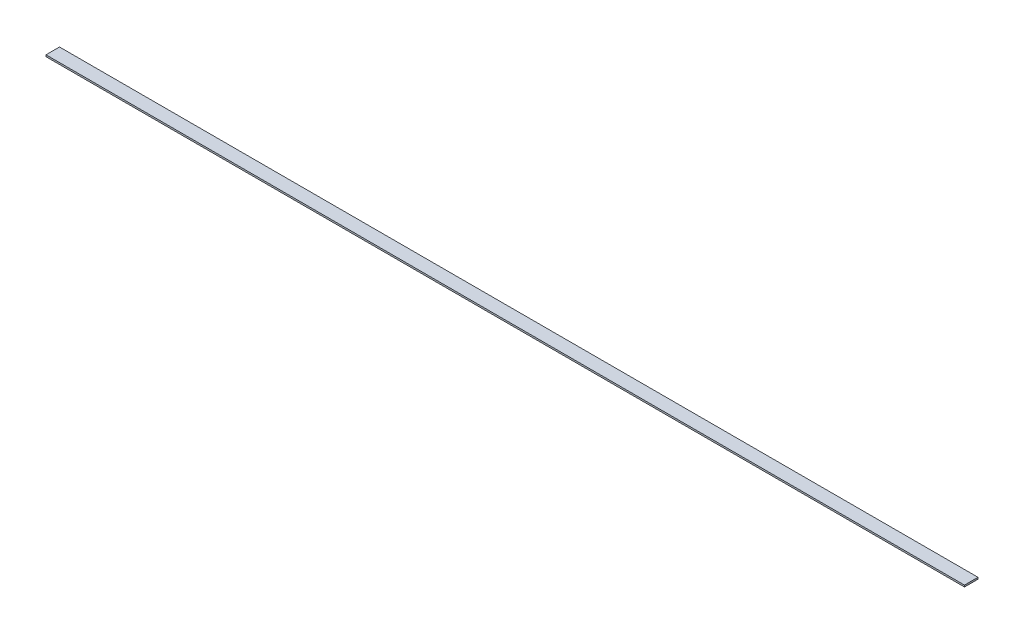
ISO-10303-21;
HEADER;
FILE_DESCRIPTION(('STEP AP214'),'2;1');
FILE_NAME('part.step','',(''),(''),'','','');
FILE_SCHEMA(('AUTOMOTIVE_DESIGN { 1 0 10303 214 1 1 1 1 }'));
ENDSEC;
DATA;
#1=APPLICATION_CONTEXT('core data for automotive mechanical design processes');
#2=APPLICATION_PROTOCOL_DEFINITION('international standard','automotive_design',2000,#1);
#3=PRODUCT_CONTEXT('',#1,'mechanical');
#4=PRODUCT('Part','Part','',(#3));
#5=PRODUCT_RELATED_PRODUCT_CATEGORY('part','',(#4));
#6=PRODUCT_DEFINITION_FORMATION('','',#4);
#7=PRODUCT_DEFINITION_CONTEXT('part definition',#1,'design');
#8=PRODUCT_DEFINITION('design','',#6,#7);
#9=PRODUCT_DEFINITION_SHAPE('','',#8);
#10=(LENGTH_UNIT() NAMED_UNIT(*) SI_UNIT(.MILLI.,.METRE.));
#11=(NAMED_UNIT(*) PLANE_ANGLE_UNIT() SI_UNIT($,.RADIAN.));
#12=(NAMED_UNIT(*) SI_UNIT($,.STERADIAN.) SOLID_ANGLE_UNIT());
#13=UNCERTAINTY_MEASURE_WITH_UNIT(LENGTH_MEASURE(1.E-05),#10,'distance_accuracy_value','');
#14=(GEOMETRIC_REPRESENTATION_CONTEXT(3) GLOBAL_UNCERTAINTY_ASSIGNED_CONTEXT((#13)) GLOBAL_UNIT_ASSIGNED_CONTEXT((#10,
#11,#12)) REPRESENTATION_CONTEXT('',''));
#15=CARTESIAN_POINT('',(0.,0.,0.));
#16=DIRECTION('',(0.,0.,1.));
#17=DIRECTION('',(1.,0.,0.));
#18=AXIS2_PLACEMENT_3D('',#15,#16,#17);
#19=CARTESIAN_POINT('',(863.6,3.17499999999987,12.6999999999997));
#20=DIRECTION('',(-1.,0.,0.));
#21=DIRECTION('',(0.,0.,1.));
#22=AXIS2_PLACEMENT_3D('',#19,#20,#21);
#23=PLANE('',#22);
#24=DIRECTION('',(0.,0.,-1.));
#25=VECTOR('',#24,1.);
#26=CARTESIAN_POINT('',(863.6,0.,12.7));
#27=LINE('',#26,#25);
#28=CARTESIAN_POINT('',(863.6,0.,12.7));
#29=VERTEX_POINT('',#28);
#30=CARTESIAN_POINT('',(863.6,0.,-12.7000000000001));
#31=VERTEX_POINT('',#30);
#32=EDGE_CURVE('E122',#29,#31,#27,.T.);
#33=ORIENTED_EDGE('',*,*,#32,.T.);
#34=DIRECTION('',(0.,-1.,0.));
#35=VECTOR('',#34,1.);
#36=CARTESIAN_POINT('',(863.6,3.17500000000013,-12.7000000000003));
#37=LINE('',#36,#35);
#38=CARTESIAN_POINT('',(863.6,3.17500000000013,-12.7000000000003));
#39=VERTEX_POINT('',#38);
#40=EDGE_CURVE('E11',#39,#31,#37,.T.);
#41=ORIENTED_EDGE('',*,*,#40,.F.);
#42=DIRECTION('',(0.,0.,-1.));
#43=VECTOR('',#42,1.);
#44=CARTESIAN_POINT('',(863.6,3.17499999999987,12.6999999999997));
#45=LINE('',#44,#43);
#46=CARTESIAN_POINT('',(863.6,3.17499999999987,12.6999999999997));
#47=VERTEX_POINT('',#46);
#48=EDGE_CURVE('E104',#47,#39,#45,.T.);
#49=ORIENTED_EDGE('',*,*,#48,.F.);
#50=DIRECTION('',(0.,-1.,0.));
#51=VECTOR('',#50,1.);
#52=CARTESIAN_POINT('',(863.6,3.17499999999987,12.6999999999997));
#53=LINE('',#52,#51);
#54=EDGE_CURVE('E118',#47,#29,#53,.T.);
#55=ORIENTED_EDGE('',*,*,#54,.T.);
#56=EDGE_LOOP('',(#33,#41,#49,#55));
#57=FACE_BOUND('',#56,.T.);
#58=ADVANCED_FACE('F44',(#57),#23,.F.);
#59=CARTESIAN_POINT('',(-863.6,3.17500000000013,-12.7000000000003));
#60=DIRECTION('',(0.,0.,1.));
#61=DIRECTION('',(1.,0.,0.));
#62=AXIS2_PLACEMENT_3D('',#59,#60,#61);
#63=PLANE('',#62);
#64=DIRECTION('',(-1.,0.,0.));
#65=VECTOR('',#64,1.);
#66=CARTESIAN_POINT('',(-863.6,0.,-12.7000000000001));
#67=LINE('',#66,#65);
#68=CARTESIAN_POINT('',(-863.6,0.,-12.7000000000001));
#69=VERTEX_POINT('',#68);
#70=EDGE_CURVE('E109',#31,#69,#67,.T.);
#71=ORIENTED_EDGE('',*,*,#70,.T.);
#72=DIRECTION('',(0.,-1.,0.));
#73=VECTOR('',#72,1.);
#74=CARTESIAN_POINT('',(-863.6,3.17500000000013,-12.7000000000003));
#75=LINE('',#74,#73);
#76=CARTESIAN_POINT('',(-863.6,3.17500000000013,-12.7000000000003));
#77=VERTEX_POINT('',#76);
#78=EDGE_CURVE('E53',#77,#69,#75,.T.);
#79=ORIENTED_EDGE('',*,*,#78,.F.);
#80=DIRECTION('',(-1.,0.,0.));
#81=VECTOR('',#80,1.);
#82=CARTESIAN_POINT('',(-863.6,3.17500000000013,-12.7000000000003));
#83=LINE('',#82,#81);
#84=EDGE_CURVE('E99',#39,#77,#83,.T.);
#85=ORIENTED_EDGE('',*,*,#84,.F.);
#86=ORIENTED_EDGE('',*,*,#40,.T.);
#87=EDGE_LOOP('',(#71,#79,#85,#86));
#88=FACE_BOUND('',#87,.T.);
#89=ADVANCED_FACE('F108',(#88),#63,.F.);
#90=CARTESIAN_POINT('',(-863.6,3.17499999999987,12.6999999999997));
#91=DIRECTION('',(1.,0.,0.));
#92=DIRECTION('',(0.,0.,-1.));
#93=AXIS2_PLACEMENT_3D('',#90,#91,#92);
#94=PLANE('',#93);
#95=DIRECTION('',(0.,0.,1.));
#96=VECTOR('',#95,1.);
#97=CARTESIAN_POINT('',(-863.6,0.,12.7));
#98=LINE('',#97,#96);
#99=CARTESIAN_POINT('',(-863.6,0.,12.7));
#100=VERTEX_POINT('',#99);
#101=EDGE_CURVE('E85',#69,#100,#98,.T.);
#102=ORIENTED_EDGE('',*,*,#101,.T.);
#103=DIRECTION('',(0.,-1.,0.));
#104=VECTOR('',#103,1.);
#105=CARTESIAN_POINT('',(-863.6,3.17499999999987,12.6999999999997));
#106=LINE('',#105,#104);
#107=CARTESIAN_POINT('',(-863.6,3.17499999999987,12.6999999999997));
#108=VERTEX_POINT('',#107);
#109=EDGE_CURVE('E111',#108,#100,#106,.T.);
#110=ORIENTED_EDGE('',*,*,#109,.F.);
#111=DIRECTION('',(0.,0.,1.));
#112=VECTOR('',#111,1.);
#113=CARTESIAN_POINT('',(-863.6,3.17499999999987,12.6999999999997));
#114=LINE('',#113,#112);
#115=EDGE_CURVE('E102',#77,#108,#114,.T.);
#116=ORIENTED_EDGE('',*,*,#115,.F.);
#117=ORIENTED_EDGE('',*,*,#78,.T.);
#118=EDGE_LOOP('',(#102,#110,#116,#117));
#119=FACE_BOUND('',#118,.T.);
#120=ADVANCED_FACE('F112',(#119),#94,.F.);
#121=CARTESIAN_POINT('',(-863.6,3.17499999999987,12.6999999999997));
#122=DIRECTION('',(0.,0.,-1.));
#123=DIRECTION('',(-1.,0.,0.));
#124=AXIS2_PLACEMENT_3D('',#121,#122,#123);
#125=PLANE('',#124);
#126=DIRECTION('',(1.,0.,0.));
#127=VECTOR('',#126,1.);
#128=CARTESIAN_POINT('',(-863.6,0.,12.7));
#129=LINE('',#128,#127);
#130=EDGE_CURVE('E92',#100,#29,#129,.T.);
#131=ORIENTED_EDGE('',*,*,#130,.T.);
#132=ORIENTED_EDGE('',*,*,#54,.F.);
#133=DIRECTION('',(1.,0.,0.));
#134=VECTOR('',#133,1.);
#135=CARTESIAN_POINT('',(-863.6,3.17499999999987,12.6999999999997));
#136=LINE('',#135,#134);
#137=EDGE_CURVE('E63',#108,#47,#136,.T.);
#138=ORIENTED_EDGE('',*,*,#137,.F.);
#139=ORIENTED_EDGE('',*,*,#109,.T.);
#140=EDGE_LOOP('',(#131,#132,#138,#139));
#141=FACE_BOUND('',#140,.T.);
#142=ADVANCED_FACE('F137',(#141),#125,.F.);
#143=CARTESIAN_POINT('',(0.,3.175,-5.27355936696949E-13));
#144=DIRECTION('',(0.,-1.,0.));
#145=DIRECTION('',(0.,0.,-1.));
#146=AXIS2_PLACEMENT_3D('',#143,#144,#145);
#147=PLANE('',#146);
#148=ORIENTED_EDGE('',*,*,#48,.T.);
#149=ORIENTED_EDGE('',*,*,#84,.T.);
#150=ORIENTED_EDGE('',*,*,#115,.T.);
#151=ORIENTED_EDGE('',*,*,#137,.T.);
#152=EDGE_LOOP('',(#148,#149,#150,#151));
#153=FACE_BOUND('',#152,.T.);
#154=ADVANCED_FACE('F100',(#153),#147,.F.);
#155=CARTESIAN_POINT('',(0.,0.,0.));
#156=DIRECTION('',(0.,-1.,0.));
#157=DIRECTION('',(0.,0.,-1.));
#158=AXIS2_PLACEMENT_3D('',#155,#156,#157);
#159=PLANE('',#158);
#160=ORIENTED_EDGE('',*,*,#32,.F.);
#161=ORIENTED_EDGE('',*,*,#130,.F.);
#162=ORIENTED_EDGE('',*,*,#101,.F.);
#163=ORIENTED_EDGE('',*,*,#70,.F.);
#164=EDGE_LOOP('',(#160,#161,#162,#163));
#165=FACE_BOUND('',#164,.T.);
#166=ADVANCED_FACE('F140',(#165),#159,.T.);
#167=CLOSED_SHELL('',(#58,#89,#120,#142,#154,#166));
#168=MANIFOLD_SOLID_BREP('B2',#167);
#169=ADVANCED_BREP_SHAPE_REPRESENTATION('',(#18,#168),#14);
#170=SHAPE_DEFINITION_REPRESENTATION(#9,#169);
ENDSEC;
END-ISO-10303-21;
